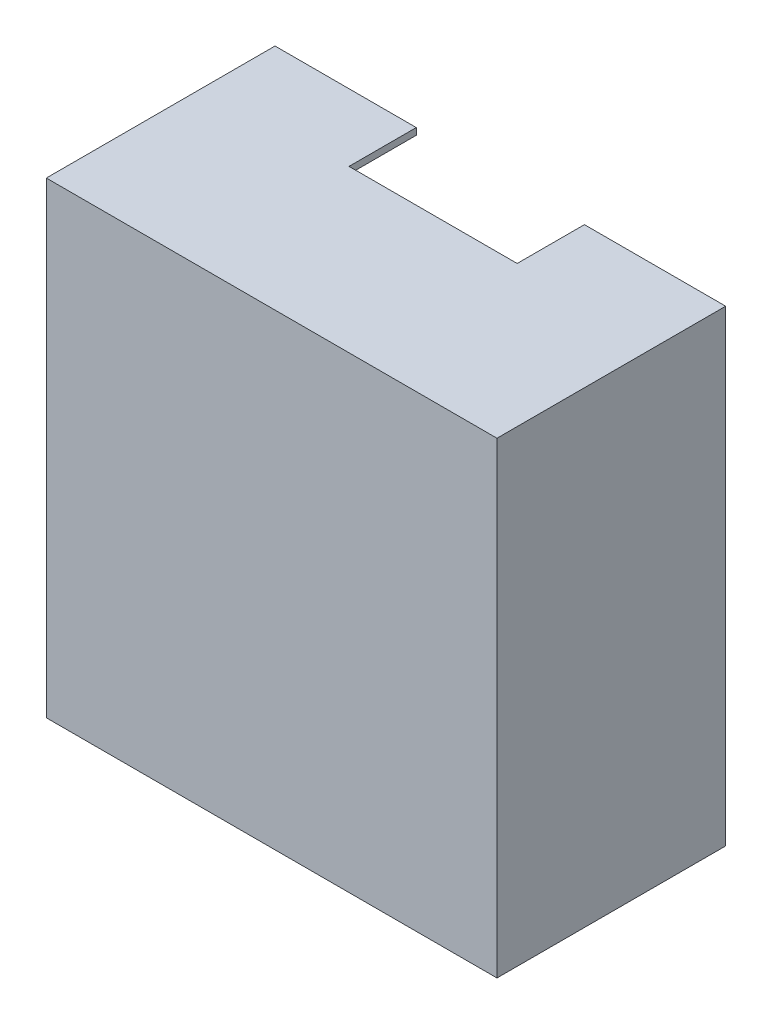
ISO-10303-21;
HEADER;
FILE_DESCRIPTION(('STEP AP214'),'2;1');
FILE_NAME('part.step','',(''),(''),'','','');
FILE_SCHEMA(('AUTOMOTIVE_DESIGN { 1 0 10303 214 1 1 1 1 }'));
ENDSEC;
DATA;
#1=APPLICATION_CONTEXT('core data for automotive mechanical design processes');
#2=APPLICATION_PROTOCOL_DEFINITION('international standard','automotive_design',2000,#1);
#3=PRODUCT_CONTEXT('',#1,'mechanical');
#4=PRODUCT('Part','Part','',(#3));
#5=PRODUCT_RELATED_PRODUCT_CATEGORY('part','',(#4));
#6=PRODUCT_DEFINITION_FORMATION('','',#4);
#7=PRODUCT_DEFINITION_CONTEXT('part definition',#1,'design');
#8=PRODUCT_DEFINITION('design','',#6,#7);
#9=PRODUCT_DEFINITION_SHAPE('','',#8);
#10=(LENGTH_UNIT() NAMED_UNIT(*) SI_UNIT(.MILLI.,.METRE.));
#11=(NAMED_UNIT(*) PLANE_ANGLE_UNIT() SI_UNIT($,.RADIAN.));
#12=(NAMED_UNIT(*) SI_UNIT($,.STERADIAN.) SOLID_ANGLE_UNIT());
#13=UNCERTAINTY_MEASURE_WITH_UNIT(LENGTH_MEASURE(1.E-05),#10,'distance_accuracy_value','');
#14=(GEOMETRIC_REPRESENTATION_CONTEXT(3) GLOBAL_UNCERTAINTY_ASSIGNED_CONTEXT((#13)) GLOBAL_UNIT_ASSIGNED_CONTEXT((#10,
#11,#12)) REPRESENTATION_CONTEXT('',''));
#15=CARTESIAN_POINT('',(0.,0.,0.));
#16=DIRECTION('',(0.,0.,1.));
#17=DIRECTION('',(1.,0.,0.));
#18=AXIS2_PLACEMENT_3D('',#15,#16,#17);
#19=CARTESIAN_POINT('',(-134.,278.,68.));
#20=DIRECTION('',(1.,0.,0.));
#21=DIRECTION('',(0.,0.,-1.));
#22=AXIS2_PLACEMENT_3D('',#19,#20,#21);
#23=PLANE('',#22);
#24=DIRECTION('',(0.,0.,1.));
#25=VECTOR('',#24,1.);
#26=CARTESIAN_POINT('',(-134.,0.,68.));
#27=LINE('',#26,#25);
#28=CARTESIAN_POINT('',(-134.,0.,-68.));
#29=VERTEX_POINT('',#28);
#30=CARTESIAN_POINT('',(-134.,0.,68.));
#31=VERTEX_POINT('',#30);
#32=EDGE_CURVE('E220',#29,#31,#27,.T.);
#33=ORIENTED_EDGE('',*,*,#32,.T.);
#34=DIRECTION('',(0.,-1.,0.));
#35=VECTOR('',#34,1.);
#36=CARTESIAN_POINT('',(-134.,278.,68.));
#37=LINE('',#36,#35);
#38=CARTESIAN_POINT('',(-134.,278.,68.));
#39=VERTEX_POINT('',#38);
#40=EDGE_CURVE('E12',#39,#31,#37,.T.);
#41=ORIENTED_EDGE('',*,*,#40,.F.);
#42=DIRECTION('',(0.,0.,1.));
#43=VECTOR('',#42,1.);
#44=CARTESIAN_POINT('',(-134.,278.,68.));
#45=LINE('',#44,#43);
#46=CARTESIAN_POINT('',(-134.,278.,-68.));
#47=VERTEX_POINT('',#46);
#48=EDGE_CURVE('E221',#47,#39,#45,.T.);
#49=ORIENTED_EDGE('',*,*,#48,.F.);
#50=DIRECTION('',(0.,-1.,0.));
#51=VECTOR('',#50,1.);
#52=CARTESIAN_POINT('',(-134.,278.,-68.));
#53=LINE('',#52,#51);
#54=EDGE_CURVE('E237',#47,#29,#53,.T.);
#55=ORIENTED_EDGE('',*,*,#54,.T.);
#56=EDGE_LOOP('',(#33,#41,#49,#55));
#57=FACE_BOUND('',#56,.T.);
#58=ADVANCED_FACE('F47',(#57),#23,.F.);
#59=CARTESIAN_POINT('',(134.,278.,68.));
#60=DIRECTION('',(0.,0.,-1.));
#61=DIRECTION('',(-1.,0.,0.));
#62=AXIS2_PLACEMENT_3D('',#59,#60,#61);
#63=PLANE('',#62);
#64=DIRECTION('',(1.,0.,0.));
#65=VECTOR('',#64,1.);
#66=CARTESIAN_POINT('',(134.,0.,68.));
#67=LINE('',#66,#65);
#68=CARTESIAN_POINT('',(134.,0.,68.));
#69=VERTEX_POINT('',#68);
#70=EDGE_CURVE('E241',#31,#69,#67,.T.);
#71=ORIENTED_EDGE('',*,*,#70,.T.);
#72=DIRECTION('',(0.,-1.,0.));
#73=VECTOR('',#72,1.);
#74=CARTESIAN_POINT('',(134.,278.,68.));
#75=LINE('',#74,#73);
#76=CARTESIAN_POINT('',(134.,278.,68.));
#77=VERTEX_POINT('',#76);
#78=EDGE_CURVE('E55',#77,#69,#75,.T.);
#79=ORIENTED_EDGE('',*,*,#78,.F.);
#80=DIRECTION('',(1.,0.,0.));
#81=VECTOR('',#80,1.);
#82=CARTESIAN_POINT('',(134.,278.,68.));
#83=LINE('',#82,#81);
#84=EDGE_CURVE('E225',#39,#77,#83,.T.);
#85=ORIENTED_EDGE('',*,*,#84,.F.);
#86=ORIENTED_EDGE('',*,*,#40,.T.);
#87=EDGE_LOOP('',(#71,#79,#85,#86));
#88=FACE_BOUND('',#87,.T.);
#89=ADVANCED_FACE('F307',(#88),#63,.F.);
#90=CARTESIAN_POINT('',(134.,278.,68.));
#91=DIRECTION('',(-1.,0.,0.));
#92=DIRECTION('',(0.,0.,1.));
#93=AXIS2_PLACEMENT_3D('',#90,#91,#92);
#94=PLANE('',#93);
#95=DIRECTION('',(0.,0.,-1.));
#96=VECTOR('',#95,1.);
#97=CARTESIAN_POINT('',(134.,0.,68.));
#98=LINE('',#97,#96);
#99=CARTESIAN_POINT('',(134.,0.,-68.));
#100=VERTEX_POINT('',#99);
#101=EDGE_CURVE('E244',#69,#100,#98,.T.);
#102=ORIENTED_EDGE('',*,*,#101,.T.);
#103=DIRECTION('',(0.,-1.,0.));
#104=VECTOR('',#103,1.);
#105=CARTESIAN_POINT('',(134.,278.,-68.));
#106=LINE('',#105,#104);
#107=CARTESIAN_POINT('',(134.,278.,-68.));
#108=VERTEX_POINT('',#107);
#109=EDGE_CURVE('E252',#108,#100,#106,.T.);
#110=ORIENTED_EDGE('',*,*,#109,.F.);
#111=DIRECTION('',(0.,0.,-1.));
#112=VECTOR('',#111,1.);
#113=CARTESIAN_POINT('',(134.,278.,68.));
#114=LINE('',#113,#112);
#115=EDGE_CURVE('E229',#77,#108,#114,.T.);
#116=ORIENTED_EDGE('',*,*,#115,.F.);
#117=ORIENTED_EDGE('',*,*,#78,.T.);
#118=EDGE_LOOP('',(#102,#110,#116,#117));
#119=FACE_BOUND('',#118,.T.);
#120=ADVANCED_FACE('F261',(#119),#94,.F.);
#121=CARTESIAN_POINT('',(134.,278.,-68.));
#122=DIRECTION('',(0.,0.,1.));
#123=DIRECTION('',(1.,0.,0.));
#124=AXIS2_PLACEMENT_3D('',#121,#122,#123);
#125=PLANE('',#124);
#126=DIRECTION('',(-1.,0.,0.));
#127=VECTOR('',#126,1.);
#128=CARTESIAN_POINT('',(134.,278.,-68.));
#129=LINE('',#128,#127);
#130=CARTESIAN_POINT('',(-50.,278.,-68.));
#131=VERTEX_POINT('',#130);
#132=EDGE_CURVE('E232',#131,#47,#129,.T.);
#133=ORIENTED_EDGE('',*,*,#132,.F.);
#134=DIRECTION('',(0.,1.,0.));
#135=VECTOR('',#134,1.);
#136=CARTESIAN_POINT('',(-50.,-0.000999999999973245,-68.));
#137=LINE('',#136,#135);
#138=CARTESIAN_POINT('',(-50.,274.,-68.));
#139=VERTEX_POINT('',#138);
#140=EDGE_CURVE('E157',#139,#131,#137,.T.);
#141=ORIENTED_EDGE('',*,*,#140,.F.);
#142=DIRECTION('',(1.,0.,0.));
#143=VECTOR('',#142,1.);
#144=CARTESIAN_POINT('',(-130.,274.,-68.));
#145=LINE('',#144,#143);
#146=CARTESIAN_POINT('',(-130.,274.,-68.));
#147=VERTEX_POINT('',#146);
#148=EDGE_CURVE('E162',#147,#139,#145,.T.);
#149=ORIENTED_EDGE('',*,*,#148,.F.);
#150=DIRECTION('',(0.,1.,0.));
#151=VECTOR('',#150,1.);
#152=CARTESIAN_POINT('',(-130.,4.,-68.));
#153=LINE('',#152,#151);
#154=CARTESIAN_POINT('',(-130.,4.,-68.));
#155=VERTEX_POINT('',#154);
#156=EDGE_CURVE('E200',#155,#147,#153,.T.);
#157=ORIENTED_EDGE('',*,*,#156,.F.);
#158=DIRECTION('',(-1.,0.,0.));
#159=VECTOR('',#158,1.);
#160=CARTESIAN_POINT('',(130.,4.,-68.));
#161=LINE('',#160,#159);
#162=CARTESIAN_POINT('',(130.,4.,-68.));
#163=VERTEX_POINT('',#162);
#164=EDGE_CURVE('E196',#163,#155,#161,.T.);
#165=ORIENTED_EDGE('',*,*,#164,.F.);
#166=DIRECTION('',(0.,-1.,0.));
#167=VECTOR('',#166,1.);
#168=CARTESIAN_POINT('',(130.,274.,-68.));
#169=LINE('',#168,#167);
#170=CARTESIAN_POINT('',(130.,274.,-68.));
#171=VERTEX_POINT('',#170);
#172=EDGE_CURVE('E70',#171,#163,#169,.T.);
#173=ORIENTED_EDGE('',*,*,#172,.F.);
#174=CARTESIAN_POINT('',(50.,274.,-68.));
#175=VERTEX_POINT('',#174);
#176=EDGE_CURVE('E204',#175,#171,#145,.T.);
#177=ORIENTED_EDGE('',*,*,#176,.F.);
#178=DIRECTION('',(0.,1.,0.));
#179=VECTOR('',#178,1.);
#180=CARTESIAN_POINT('',(50.,-0.000999999999973245,-68.));
#181=LINE('',#180,#179);
#182=CARTESIAN_POINT('',(50.,278.,-68.));
#183=VERTEX_POINT('',#182);
#184=EDGE_CURVE('E177',#175,#183,#181,.T.);
#185=ORIENTED_EDGE('',*,*,#184,.T.);
#186=EDGE_CURVE('E233',#108,#183,#129,.T.);
#187=ORIENTED_EDGE('',*,*,#186,.F.);
#188=ORIENTED_EDGE('',*,*,#109,.T.);
#189=DIRECTION('',(-1.,0.,0.));
#190=VECTOR('',#189,1.);
#191=CARTESIAN_POINT('',(134.,0.,-68.));
#192=LINE('',#191,#190);
#193=EDGE_CURVE('E226',#100,#29,#192,.T.);
#194=ORIENTED_EDGE('',*,*,#193,.T.);
#195=ORIENTED_EDGE('',*,*,#54,.F.);
#196=EDGE_LOOP('',(#133,#141,#149,#157,#165,#173,#177,#185,#187,#188,#194,#195));
#197=FACE_BOUND('',#196,.T.);
#198=ADVANCED_FACE('F271',(#197),#125,.F.);
#199=CARTESIAN_POINT('',(0.,278.,0.));
#200=DIRECTION('',(0.,1.,0.));
#201=DIRECTION('',(0.,0.,1.));
#202=AXIS2_PLACEMENT_3D('',#199,#200,#201);
#203=PLANE('',#202);
#204=DIRECTION('',(0.,0.,1.));
#205=VECTOR('',#204,1.);
#206=CARTESIAN_POINT('',(-50.,278.,-68.));
#207=LINE('',#206,#205);
#208=CARTESIAN_POINT('',(-50.,278.,-28.));
#209=VERTEX_POINT('',#208);
#210=EDGE_CURVE('E144',#131,#209,#207,.T.);
#211=ORIENTED_EDGE('',*,*,#210,.F.);
#212=ORIENTED_EDGE('',*,*,#132,.T.);
#213=ORIENTED_EDGE('',*,*,#48,.T.);
#214=ORIENTED_EDGE('',*,*,#84,.T.);
#215=ORIENTED_EDGE('',*,*,#115,.T.);
#216=ORIENTED_EDGE('',*,*,#186,.T.);
#217=DIRECTION('',(0.,0.,-1.));
#218=VECTOR('',#217,1.);
#219=CARTESIAN_POINT('',(50.,278.,-68.));
#220=LINE('',#219,#218);
#221=CARTESIAN_POINT('',(50.,278.,-28.));
#222=VERTEX_POINT('',#221);
#223=EDGE_CURVE('E150',#222,#183,#220,.T.);
#224=ORIENTED_EDGE('',*,*,#223,.F.);
#225=DIRECTION('',(1.,0.,0.));
#226=VECTOR('',#225,1.);
#227=CARTESIAN_POINT('',(-50.,278.,-28.));
#228=LINE('',#227,#226);
#229=EDGE_CURVE('E167',#209,#222,#228,.T.);
#230=ORIENTED_EDGE('',*,*,#229,.F.);
#231=EDGE_LOOP('',(#211,#212,#213,#214,#215,#216,#224,#230));
#232=FACE_BOUND('',#231,.T.);
#233=ADVANCED_FACE('F277',(#232),#203,.T.);
#234=CARTESIAN_POINT('',(0.,0.,0.));
#235=DIRECTION('',(0.,1.,0.));
#236=DIRECTION('',(0.,0.,1.));
#237=AXIS2_PLACEMENT_3D('',#234,#235,#236);
#238=PLANE('',#237);
#239=ORIENTED_EDGE('',*,*,#32,.F.);
#240=ORIENTED_EDGE('',*,*,#193,.F.);
#241=ORIENTED_EDGE('',*,*,#101,.F.);
#242=ORIENTED_EDGE('',*,*,#70,.F.);
#243=EDGE_LOOP('',(#239,#240,#241,#242));
#244=FACE_BOUND('',#243,.T.);
#245=ADVANCED_FACE('F267',(#244),#238,.F.);
#246=CARTESIAN_POINT('',(130.,274.,442.833296279826));
#247=DIRECTION('',(1.,0.,0.));
#248=DIRECTION('',(0.,0.,-1.));
#249=AXIS2_PLACEMENT_3D('',#246,#247,#248);
#250=PLANE('',#249);
#251=DIRECTION('',(0.,1.,0.));
#252=VECTOR('',#251,1.);
#253=CARTESIAN_POINT('',(130.,274.,66.));
#254=LINE('',#253,#252);
#255=CARTESIAN_POINT('',(130.,4.,66.));
#256=VERTEX_POINT('',#255);
#257=CARTESIAN_POINT('',(130.,274.,66.));
#258=VERTEX_POINT('',#257);
#259=EDGE_CURVE('E190',#256,#258,#254,.T.);
#260=ORIENTED_EDGE('',*,*,#259,.T.);
#261=DIRECTION('',(0.,0.,-1.));
#262=VECTOR('',#261,1.);
#263=CARTESIAN_POINT('',(130.,274.,442.833296279826));
#264=LINE('',#263,#262);
#265=EDGE_CURVE('E187',#258,#171,#264,.T.);
#266=ORIENTED_EDGE('',*,*,#265,.T.);
#267=ORIENTED_EDGE('',*,*,#172,.T.);
#268=DIRECTION('',(0.,0.,-1.));
#269=VECTOR('',#268,1.);
#270=CARTESIAN_POINT('',(130.,4.,442.833296279826));
#271=LINE('',#270,#269);
#272=EDGE_CURVE('E207',#256,#163,#271,.T.);
#273=ORIENTED_EDGE('',*,*,#272,.F.);
#274=EDGE_LOOP('',(#260,#266,#267,#273));
#275=FACE_BOUND('',#274,.T.);
#276=ADVANCED_FACE('F282',(#275),#250,.F.);
#277=CARTESIAN_POINT('',(-130.,274.,442.833296279826));
#278=DIRECTION('',(0.,1.,0.));
#279=DIRECTION('',(0.,0.,1.));
#280=AXIS2_PLACEMENT_3D('',#277,#278,#279);
#281=PLANE('',#280);
#282=ORIENTED_EDGE('',*,*,#148,.T.);
#283=DIRECTION('',(0.,0.,-1.));
#284=VECTOR('',#283,1.);
#285=CARTESIAN_POINT('',(-50.,274.,-68.));
#286=LINE('',#285,#284);
#287=CARTESIAN_POINT('',(-50.,274.,-28.));
#288=VERTEX_POINT('',#287);
#289=EDGE_CURVE('E141',#288,#139,#286,.T.);
#290=ORIENTED_EDGE('',*,*,#289,.F.);
#291=DIRECTION('',(-1.,0.,0.));
#292=VECTOR('',#291,1.);
#293=CARTESIAN_POINT('',(-50.,274.,-28.));
#294=LINE('',#293,#292);
#295=CARTESIAN_POINT('',(50.,274.,-28.));
#296=VERTEX_POINT('',#295);
#297=EDGE_CURVE('E153',#296,#288,#294,.T.);
#298=ORIENTED_EDGE('',*,*,#297,.F.);
#299=DIRECTION('',(0.,0.,1.));
#300=VECTOR('',#299,1.);
#301=CARTESIAN_POINT('',(50.,274.,-68.));
#302=LINE('',#301,#300);
#303=EDGE_CURVE('E62',#175,#296,#302,.T.);
#304=ORIENTED_EDGE('',*,*,#303,.F.);
#305=ORIENTED_EDGE('',*,*,#176,.T.);
#306=ORIENTED_EDGE('',*,*,#265,.F.);
#307=DIRECTION('',(-1.,0.,0.));
#308=VECTOR('',#307,1.);
#309=CARTESIAN_POINT('',(-130.,274.,66.));
#310=LINE('',#309,#308);
#311=CARTESIAN_POINT('',(-130.,274.,66.));
#312=VERTEX_POINT('',#311);
#313=EDGE_CURVE('E186',#258,#312,#310,.T.);
#314=ORIENTED_EDGE('',*,*,#313,.T.);
#315=DIRECTION('',(0.,0.,-1.));
#316=VECTOR('',#315,1.);
#317=CARTESIAN_POINT('',(-130.,274.,442.833296279826));
#318=LINE('',#317,#316);
#319=EDGE_CURVE('E210',#312,#147,#318,.T.);
#320=ORIENTED_EDGE('',*,*,#319,.T.);
#321=EDGE_LOOP('',(#282,#290,#298,#304,#305,#306,#314,#320));
#322=FACE_BOUND('',#321,.T.);
#323=ADVANCED_FACE('F160',(#322),#281,.F.);
#324=CARTESIAN_POINT('',(-130.,4.,442.833296279826));
#325=DIRECTION('',(-1.,0.,0.));
#326=DIRECTION('',(0.,0.,1.));
#327=AXIS2_PLACEMENT_3D('',#324,#325,#326);
#328=PLANE('',#327);
#329=DIRECTION('',(0.,-1.,0.));
#330=VECTOR('',#329,1.);
#331=CARTESIAN_POINT('',(-130.,4.,66.));
#332=LINE('',#331,#330);
#333=CARTESIAN_POINT('',(-130.,4.,66.));
#334=VERTEX_POINT('',#333);
#335=EDGE_CURVE('E183',#312,#334,#332,.T.);
#336=ORIENTED_EDGE('',*,*,#335,.T.);
#337=DIRECTION('',(0.,0.,-1.));
#338=VECTOR('',#337,1.);
#339=CARTESIAN_POINT('',(-130.,4.,442.833296279826));
#340=LINE('',#339,#338);
#341=EDGE_CURVE('E213',#334,#155,#340,.T.);
#342=ORIENTED_EDGE('',*,*,#341,.T.);
#343=ORIENTED_EDGE('',*,*,#156,.T.);
#344=ORIENTED_EDGE('',*,*,#319,.F.);
#345=EDGE_LOOP('',(#336,#342,#343,#344));
#346=FACE_BOUND('',#345,.T.);
#347=ADVANCED_FACE('F296',(#346),#328,.F.);
#348=CARTESIAN_POINT('',(130.,4.,442.833296279826));
#349=DIRECTION('',(0.,-1.,0.));
#350=DIRECTION('',(0.,0.,-1.));
#351=AXIS2_PLACEMENT_3D('',#348,#349,#350);
#352=PLANE('',#351);
#353=DIRECTION('',(1.,0.,0.));
#354=VECTOR('',#353,1.);
#355=CARTESIAN_POINT('',(130.,4.,66.));
#356=LINE('',#355,#354);
#357=EDGE_CURVE('E193',#334,#256,#356,.T.);
#358=ORIENTED_EDGE('',*,*,#357,.T.);
#359=ORIENTED_EDGE('',*,*,#272,.T.);
#360=ORIENTED_EDGE('',*,*,#164,.T.);
#361=ORIENTED_EDGE('',*,*,#341,.F.);
#362=EDGE_LOOP('',(#358,#359,#360,#361));
#363=FACE_BOUND('',#362,.T.);
#364=ADVANCED_FACE('F289',(#363),#352,.F.);
#365=CARTESIAN_POINT('',(134.,278.,66.));
#366=DIRECTION('',(0.,0.,-1.));
#367=DIRECTION('',(-1.,0.,0.));
#368=AXIS2_PLACEMENT_3D('',#365,#366,#367);
#369=PLANE('',#368);
#370=ORIENTED_EDGE('',*,*,#259,.F.);
#371=ORIENTED_EDGE('',*,*,#357,.F.);
#372=ORIENTED_EDGE('',*,*,#335,.F.);
#373=ORIENTED_EDGE('',*,*,#313,.F.);
#374=EDGE_LOOP('',(#370,#371,#372,#373));
#375=FACE_BOUND('',#374,.T.);
#376=ADVANCED_FACE('F293',(#375),#369,.T.);
#377=CARTESIAN_POINT('',(-50.,-0.000999999999973245,-68.));
#378=DIRECTION('',(-1.,0.,0.));
#379=DIRECTION('',(0.,0.,1.));
#380=AXIS2_PLACEMENT_3D('',#377,#378,#379);
#381=PLANE('',#380);
#382=ORIENTED_EDGE('',*,*,#289,.T.);
#383=ORIENTED_EDGE('',*,*,#140,.T.);
#384=ORIENTED_EDGE('',*,*,#210,.T.);
#385=DIRECTION('',(0.,1.,0.));
#386=VECTOR('',#385,1.);
#387=CARTESIAN_POINT('',(-50.,-0.000999999999973245,-28.));
#388=LINE('',#387,#386);
#389=EDGE_CURVE('E137',#288,#209,#388,.T.);
#390=ORIENTED_EDGE('',*,*,#389,.F.);
#391=EDGE_LOOP('',(#382,#383,#384,#390));
#392=FACE_BOUND('',#391,.T.);
#393=ADVANCED_FACE('F139',(#392),#381,.F.);
#394=CARTESIAN_POINT('',(50.,-0.000999999999973245,-68.));
#395=DIRECTION('',(1.,0.,0.));
#396=DIRECTION('',(0.,0.,-1.));
#397=AXIS2_PLACEMENT_3D('',#394,#395,#396);
#398=PLANE('',#397);
#399=ORIENTED_EDGE('',*,*,#303,.T.);
#400=DIRECTION('',(0.,1.,0.));
#401=VECTOR('',#400,1.);
#402=CARTESIAN_POINT('',(50.,-0.000999999999973245,-28.));
#403=LINE('',#402,#401);
#404=EDGE_CURVE('E149',#296,#222,#403,.T.);
#405=ORIENTED_EDGE('',*,*,#404,.T.);
#406=ORIENTED_EDGE('',*,*,#223,.T.);
#407=ORIENTED_EDGE('',*,*,#184,.F.);
#408=EDGE_LOOP('',(#399,#405,#406,#407));
#409=FACE_BOUND('',#408,.T.);
#410=ADVANCED_FACE('F363',(#409),#398,.F.);
#411=CARTESIAN_POINT('',(-50.,-0.000999999999973245,-28.));
#412=DIRECTION('',(0.,0.,1.));
#413=DIRECTION('',(1.,0.,0.));
#414=AXIS2_PLACEMENT_3D('',#411,#412,#413);
#415=PLANE('',#414);
#416=ORIENTED_EDGE('',*,*,#297,.T.);
#417=ORIENTED_EDGE('',*,*,#389,.T.);
#418=ORIENTED_EDGE('',*,*,#229,.T.);
#419=ORIENTED_EDGE('',*,*,#404,.F.);
#420=EDGE_LOOP('',(#416,#417,#418,#419));
#421=FACE_BOUND('',#420,.T.);
#422=ADVANCED_FACE('F154',(#421),#415,.F.);
#423=CLOSED_SHELL('',(#58,#89,#120,#198,#233,#245,#276,#323,#347,#364,#376,#393,#410,#422));
#424=MANIFOLD_SOLID_BREP('B2',#423);
#425=ADVANCED_BREP_SHAPE_REPRESENTATION('',(#18,#424),#14);
#426=SHAPE_DEFINITION_REPRESENTATION(#9,#425);
ENDSEC;
END-ISO-10303-21;
